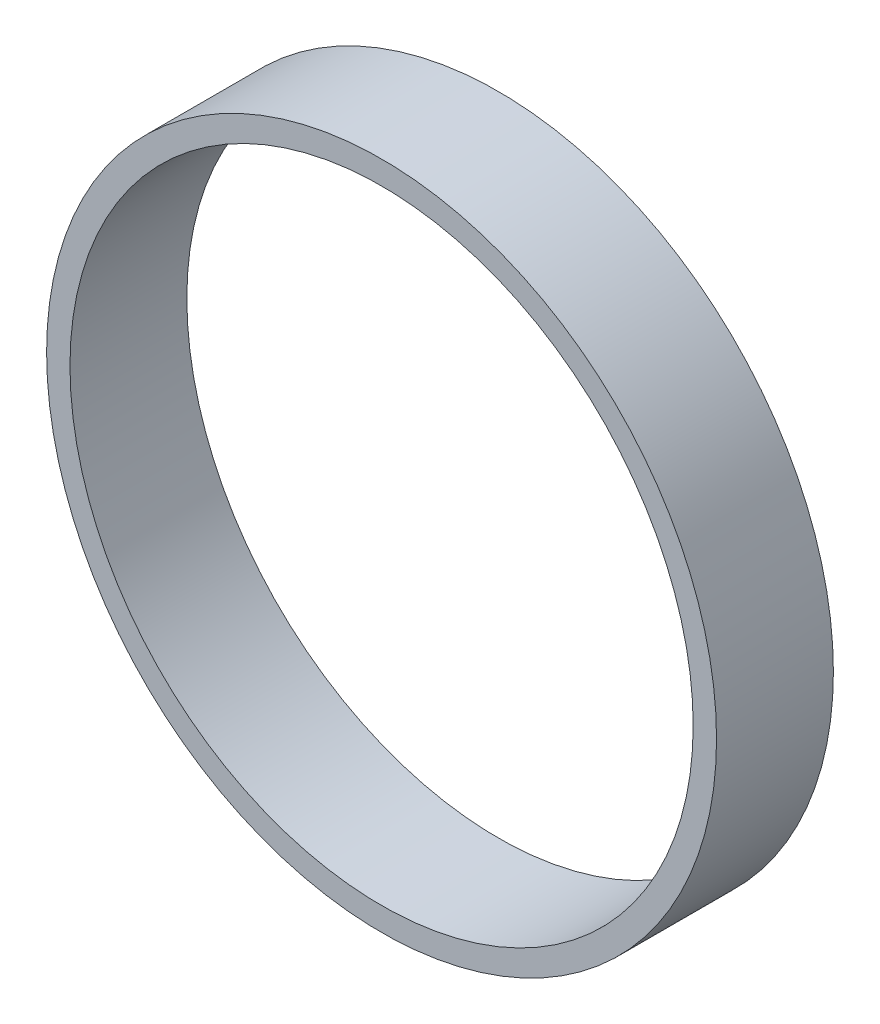
ISO-10303-21;
HEADER;
FILE_DESCRIPTION(('STEP AP214'),'2;1');
FILE_NAME('part.step','',(''),(''),'','','');
FILE_SCHEMA(('AUTOMOTIVE_DESIGN { 1 0 10303 214 1 1 1 1 }'));
ENDSEC;
DATA;
#1=APPLICATION_CONTEXT('core data for automotive mechanical design processes');
#2=APPLICATION_PROTOCOL_DEFINITION('international standard','automotive_design',2000,#1);
#3=PRODUCT_CONTEXT('',#1,'mechanical');
#4=PRODUCT('Part','Part','',(#3));
#5=PRODUCT_RELATED_PRODUCT_CATEGORY('part','',(#4));
#6=PRODUCT_DEFINITION_FORMATION('','',#4);
#7=PRODUCT_DEFINITION_CONTEXT('part definition',#1,'design');
#8=PRODUCT_DEFINITION('design','',#6,#7);
#9=PRODUCT_DEFINITION_SHAPE('','',#8);
#10=(LENGTH_UNIT() NAMED_UNIT(*) SI_UNIT(.MILLI.,.METRE.));
#11=(NAMED_UNIT(*) PLANE_ANGLE_UNIT() SI_UNIT($,.RADIAN.));
#12=(NAMED_UNIT(*) SI_UNIT($,.STERADIAN.) SOLID_ANGLE_UNIT());
#13=UNCERTAINTY_MEASURE_WITH_UNIT(LENGTH_MEASURE(1.E-05),#10,'distance_accuracy_value','');
#14=(GEOMETRIC_REPRESENTATION_CONTEXT(3) GLOBAL_UNCERTAINTY_ASSIGNED_CONTEXT((#13)) GLOBAL_UNIT_ASSIGNED_CONTEXT((#10,
#11,#12)) REPRESENTATION_CONTEXT('',''));
#15=CARTESIAN_POINT('',(0.,0.,0.));
#16=DIRECTION('',(0.,0.,1.));
#17=DIRECTION('',(1.,0.,0.));
#18=AXIS2_PLACEMENT_3D('',#15,#16,#17);
#19=CARTESIAN_POINT('',(0.,0.,19.05));
#20=DIRECTION('',(0.,0.,1.));
#21=DIRECTION('',(1.,0.,0.));
#22=AXIS2_PLACEMENT_3D('',#19,#20,#21);
#23=PLANE('',#22);
#24=CARTESIAN_POINT('',(0.,0.,19.05));
#25=DIRECTION('',(0.,0.,1.));
#26=DIRECTION('',(1.,0.,0.));
#27=AXIS2_PLACEMENT_3D('',#24,#25,#26);
#28=CIRCLE('',#27,54.61);
#29=CARTESIAN_POINT('',(-54.61,0.,19.05));
#30=VERTEX_POINT('',#29);
#31=EDGE_CURVE('E10',#30,#30,#28,.T.);
#32=ORIENTED_EDGE('',*,*,#31,.T.);
#33=EDGE_LOOP('',(#32));
#34=FACE_BOUND('',#33,.T.);
#35=CARTESIAN_POINT('',(0.,0.,19.05));
#36=DIRECTION('',(0.,0.,1.));
#37=DIRECTION('',(1.,0.,0.));
#38=AXIS2_PLACEMENT_3D('',#35,#36,#37);
#39=CIRCLE('',#38,50.8);
#40=CARTESIAN_POINT('',(-50.8,0.,19.05));
#41=VERTEX_POINT('',#40);
#42=EDGE_CURVE('E54',#41,#41,#39,.T.);
#43=ORIENTED_EDGE('',*,*,#42,.F.);
#44=EDGE_LOOP('',(#43));
#45=FACE_BOUND('',#44,.T.);
#46=ADVANCED_FACE('F41',(#34,#45),#23,.T.);
#47=CARTESIAN_POINT('',(0.,0.,0.));
#48=DIRECTION('',(0.,0.,1.));
#49=DIRECTION('',(1.,0.,0.));
#50=AXIS2_PLACEMENT_3D('',#47,#48,#49);
#51=PLANE('',#50);
#52=CARTESIAN_POINT('',(0.,0.,0.));
#53=DIRECTION('',(0.,0.,1.));
#54=DIRECTION('',(1.,0.,0.));
#55=AXIS2_PLACEMENT_3D('',#52,#53,#54);
#56=CIRCLE('',#55,54.61);
#57=CARTESIAN_POINT('',(-54.61,0.,0.));
#58=VERTEX_POINT('',#57);
#59=EDGE_CURVE('E45',#58,#58,#56,.T.);
#60=ORIENTED_EDGE('',*,*,#59,.F.);
#61=EDGE_LOOP('',(#60));
#62=FACE_BOUND('',#61,.T.);
#63=CARTESIAN_POINT('',(0.,0.,0.));
#64=DIRECTION('',(0.,0.,1.));
#65=DIRECTION('',(1.,0.,0.));
#66=AXIS2_PLACEMENT_3D('',#63,#64,#65);
#67=CIRCLE('',#66,50.8);
#68=CARTESIAN_POINT('',(-50.8,0.,0.));
#69=VERTEX_POINT('',#68);
#70=EDGE_CURVE('E56',#69,#69,#67,.T.);
#71=ORIENTED_EDGE('',*,*,#70,.T.);
#72=EDGE_LOOP('',(#71));
#73=FACE_BOUND('',#72,.T.);
#74=ADVANCED_FACE('F68',(#62,#73),#51,.F.);
#75=CARTESIAN_POINT('',(0.,0.,19.05));
#76=DIRECTION('',(0.,0.,-1.));
#77=DIRECTION('',(-1.,0.,0.));
#78=AXIS2_PLACEMENT_3D('',#75,#76,#77);
#79=CYLINDRICAL_SURFACE('',#78,54.61);
#80=CARTESIAN_POINT('',(-54.61,0.,19.05));
#81=CARTESIAN_POINT('',(-54.61,0.,18.8515625));
#82=CARTESIAN_POINT('',(-54.61,0.,18.653125));
#83=CARTESIAN_POINT('',(-54.61,0.,18.25625));
#84=CARTESIAN_POINT('',(-54.61,0.,18.0578125));
#85=CARTESIAN_POINT('',(-54.61,0.,17.6609375));
#86=CARTESIAN_POINT('',(-54.61,0.,17.4625));
#87=CARTESIAN_POINT('',(-54.61,0.,17.065625));
#88=CARTESIAN_POINT('',(-54.61,0.,16.8671875));
#89=CARTESIAN_POINT('',(-54.61,0.,16.4703125));
#90=CARTESIAN_POINT('',(-54.61,0.,16.271875));
#91=CARTESIAN_POINT('',(-54.61,0.,15.875));
#92=CARTESIAN_POINT('',(-54.61,0.,15.6765625));
#93=CARTESIAN_POINT('',(-54.61,0.,15.2796875));
#94=CARTESIAN_POINT('',(-54.61,0.,15.08125));
#95=CARTESIAN_POINT('',(-54.61,0.,14.684375));
#96=CARTESIAN_POINT('',(-54.61,0.,14.4859375));
#97=CARTESIAN_POINT('',(-54.61,0.,14.0890625));
#98=CARTESIAN_POINT('',(-54.61,0.,13.890625));
#99=CARTESIAN_POINT('',(-54.61,0.,13.49375));
#100=CARTESIAN_POINT('',(-54.61,0.,13.2953125));
#101=CARTESIAN_POINT('',(-54.61,0.,12.8984375));
#102=CARTESIAN_POINT('',(-54.61,0.,12.7));
#103=CARTESIAN_POINT('',(-54.61,0.,12.303125));
#104=CARTESIAN_POINT('',(-54.61,0.,12.1046875));
#105=CARTESIAN_POINT('',(-54.61,0.,11.7078125));
#106=CARTESIAN_POINT('',(-54.61,0.,11.509375));
#107=CARTESIAN_POINT('',(-54.61,0.,11.1125));
#108=CARTESIAN_POINT('',(-54.61,0.,10.9140625));
#109=CARTESIAN_POINT('',(-54.61,0.,10.5171875));
#110=CARTESIAN_POINT('',(-54.61,0.,10.31875));
#111=CARTESIAN_POINT('',(-54.61,0.,9.921875));
#112=CARTESIAN_POINT('',(-54.61,0.,9.7234375));
#113=CARTESIAN_POINT('',(-54.61,0.,9.3265625));
#114=CARTESIAN_POINT('',(-54.61,0.,9.128125));
#115=CARTESIAN_POINT('',(-54.61,0.,8.73125));
#116=CARTESIAN_POINT('',(-54.61,0.,8.5328125));
#117=CARTESIAN_POINT('',(-54.61,0.,8.1359375));
#118=CARTESIAN_POINT('',(-54.61,0.,7.9375));
#119=CARTESIAN_POINT('',(-54.61,0.,7.540625));
#120=CARTESIAN_POINT('',(-54.61,0.,7.3421875));
#121=CARTESIAN_POINT('',(-54.61,0.,6.9453125));
#122=CARTESIAN_POINT('',(-54.61,0.,6.746875));
#123=CARTESIAN_POINT('',(-54.61,0.,6.35));
#124=CARTESIAN_POINT('',(-54.61,0.,6.1515625));
#125=CARTESIAN_POINT('',(-54.61,0.,5.7546875));
#126=CARTESIAN_POINT('',(-54.61,0.,5.55625));
#127=CARTESIAN_POINT('',(-54.61,0.,5.159375));
#128=CARTESIAN_POINT('',(-54.61,0.,4.9609375));
#129=CARTESIAN_POINT('',(-54.61,0.,4.5640625));
#130=CARTESIAN_POINT('',(-54.61,0.,4.365625));
#131=CARTESIAN_POINT('',(-54.61,0.,3.96875));
#132=CARTESIAN_POINT('',(-54.61,0.,3.7703125));
#133=CARTESIAN_POINT('',(-54.61,0.,3.3734375));
#134=CARTESIAN_POINT('',(-54.61,0.,3.175));
#135=CARTESIAN_POINT('',(-54.61,0.,2.778125));
#136=CARTESIAN_POINT('',(-54.61,0.,2.5796875));
#137=CARTESIAN_POINT('',(-54.61,0.,2.1828125));
#138=CARTESIAN_POINT('',(-54.61,0.,1.984375));
#139=CARTESIAN_POINT('',(-54.61,0.,1.5875));
#140=CARTESIAN_POINT('',(-54.61,0.,1.3890625));
#141=CARTESIAN_POINT('',(-54.61,0.,0.992187500000001));
#142=CARTESIAN_POINT('',(-54.61,0.,0.793750000000001));
#143=CARTESIAN_POINT('',(-54.61,0.,0.396875));
#144=CARTESIAN_POINT('',(-54.61,0.,0.1984375));
#145=CARTESIAN_POINT('',(-54.61,0.,0.));
#146=B_SPLINE_CURVE_WITH_KNOTS('',3,(#80,#81,#82,#83,#84,#85,#86,#87,#88,#89,#90,#91,#92,#93,
#94,#95,#96,#97,#98,#99,#100,#101,#102,#103,#104,#105,#106,#107,#108,#109,#110,#111,#112,#113,
#114,#115,#116,#117,#118,#119,#120,#121,#122,#123,#124,#125,#126,#127,#128,#129,#130,#131,#132,
#133,#134,#135,#136,#137,#138,#139,#140,#141,#142,#143,#144,#145),.UNSPECIFIED.,.F.,.F.,(4,2,2,
2,2,2,2,2,2,2,2,2,2,2,2,2,2,2,2,2,2,2,2,2,2,2,2,2,2,2,2,2,4),(0.,0.5953125,1.190625,1.7859375,
2.38125,2.9765625,3.571875,4.1671875,4.7625,5.3578125,5.953125,6.5484375,7.14375,7.7390625,
8.334375,8.9296875,9.525,10.1203125,10.715625,11.3109375,11.90625,12.5015625,13.096875,
13.6921875,14.2875,14.8828125,15.478125,16.0734375,16.66875,17.2640625,17.859375,18.4546875,
19.05),.UNSPECIFIED.);
#147=EDGE_CURVE('BSEAM43',#30,#58,#146,.T.);
#148=ORIENTED_EDGE('',*,*,#31,.F.);
#149=ORIENTED_EDGE('',*,*,#59,.T.);
#150=ORIENTED_EDGE('',*,*,#147,.T.);
#151=ORIENTED_EDGE('',*,*,#147,.F.);
#152=EDGE_LOOP('',(#148,#150,#149,#151));
#153=FACE_BOUND('',#152,.T.);
#154=ADVANCED_FACE('F43',(#153),#79,.T.);
#155=CARTESIAN_POINT('',(0.,0.,19.05));
#156=DIRECTION('',(0.,0.,-1.));
#157=DIRECTION('',(-1.,0.,0.));
#158=AXIS2_PLACEMENT_3D('',#155,#156,#157);
#159=CYLINDRICAL_SURFACE('',#158,50.8);
#160=CARTESIAN_POINT('',(-50.8,0.,19.05));
#161=CARTESIAN_POINT('',(-50.8,0.,18.8515625));
#162=CARTESIAN_POINT('',(-50.8,0.,18.653125));
#163=CARTESIAN_POINT('',(-50.8,0.,18.25625));
#164=CARTESIAN_POINT('',(-50.8,0.,18.0578125));
#165=CARTESIAN_POINT('',(-50.8,0.,17.6609375));
#166=CARTESIAN_POINT('',(-50.8,0.,17.4625));
#167=CARTESIAN_POINT('',(-50.8,0.,17.065625));
#168=CARTESIAN_POINT('',(-50.8,0.,16.8671875));
#169=CARTESIAN_POINT('',(-50.8,0.,16.4703125));
#170=CARTESIAN_POINT('',(-50.8,0.,16.271875));
#171=CARTESIAN_POINT('',(-50.8,0.,15.875));
#172=CARTESIAN_POINT('',(-50.8,0.,15.6765625));
#173=CARTESIAN_POINT('',(-50.8,0.,15.2796875));
#174=CARTESIAN_POINT('',(-50.8,0.,15.08125));
#175=CARTESIAN_POINT('',(-50.8,0.,14.684375));
#176=CARTESIAN_POINT('',(-50.8,0.,14.4859375));
#177=CARTESIAN_POINT('',(-50.8,0.,14.0890625));
#178=CARTESIAN_POINT('',(-50.8,0.,13.890625));
#179=CARTESIAN_POINT('',(-50.8,0.,13.49375));
#180=CARTESIAN_POINT('',(-50.8,0.,13.2953125));
#181=CARTESIAN_POINT('',(-50.8,0.,12.8984375));
#182=CARTESIAN_POINT('',(-50.8,0.,12.7));
#183=CARTESIAN_POINT('',(-50.8,0.,12.303125));
#184=CARTESIAN_POINT('',(-50.8,0.,12.1046875));
#185=CARTESIAN_POINT('',(-50.8,0.,11.7078125));
#186=CARTESIAN_POINT('',(-50.8,0.,11.509375));
#187=CARTESIAN_POINT('',(-50.8,0.,11.1125));
#188=CARTESIAN_POINT('',(-50.8,0.,10.9140625));
#189=CARTESIAN_POINT('',(-50.8,0.,10.5171875));
#190=CARTESIAN_POINT('',(-50.8,0.,10.31875));
#191=CARTESIAN_POINT('',(-50.8,0.,9.921875));
#192=CARTESIAN_POINT('',(-50.8,0.,9.7234375));
#193=CARTESIAN_POINT('',(-50.8,0.,9.3265625));
#194=CARTESIAN_POINT('',(-50.8,0.,9.128125));
#195=CARTESIAN_POINT('',(-50.8,0.,8.73125));
#196=CARTESIAN_POINT('',(-50.8,0.,8.5328125));
#197=CARTESIAN_POINT('',(-50.8,0.,8.1359375));
#198=CARTESIAN_POINT('',(-50.8,0.,7.9375));
#199=CARTESIAN_POINT('',(-50.8,0.,7.540625));
#200=CARTESIAN_POINT('',(-50.8,0.,7.3421875));
#201=CARTESIAN_POINT('',(-50.8,0.,6.9453125));
#202=CARTESIAN_POINT('',(-50.8,0.,6.746875));
#203=CARTESIAN_POINT('',(-50.8,0.,6.35));
#204=CARTESIAN_POINT('',(-50.8,0.,6.1515625));
#205=CARTESIAN_POINT('',(-50.8,0.,5.7546875));
#206=CARTESIAN_POINT('',(-50.8,0.,5.55625));
#207=CARTESIAN_POINT('',(-50.8,0.,5.159375));
#208=CARTESIAN_POINT('',(-50.8,0.,4.9609375));
#209=CARTESIAN_POINT('',(-50.8,0.,4.5640625));
#210=CARTESIAN_POINT('',(-50.8,0.,4.365625));
#211=CARTESIAN_POINT('',(-50.8,0.,3.96875));
#212=CARTESIAN_POINT('',(-50.8,0.,3.7703125));
#213=CARTESIAN_POINT('',(-50.8,0.,3.3734375));
#214=CARTESIAN_POINT('',(-50.8,0.,3.175));
#215=CARTESIAN_POINT('',(-50.8,0.,2.778125));
#216=CARTESIAN_POINT('',(-50.8,0.,2.5796875));
#217=CARTESIAN_POINT('',(-50.8,0.,2.1828125));
#218=CARTESIAN_POINT('',(-50.8,0.,1.984375));
#219=CARTESIAN_POINT('',(-50.8,0.,1.5875));
#220=CARTESIAN_POINT('',(-50.8,0.,1.3890625));
#221=CARTESIAN_POINT('',(-50.8,0.,0.992187500000001));
#222=CARTESIAN_POINT('',(-50.8,0.,0.793750000000001));
#223=CARTESIAN_POINT('',(-50.8,0.,0.396875));
#224=CARTESIAN_POINT('',(-50.8,0.,0.1984375));
#225=CARTESIAN_POINT('',(-50.8,0.,0.));
#226=B_SPLINE_CURVE_WITH_KNOTS('',3,(#160,#161,#162,#163,#164,#165,#166,#167,#168,#169,#170,
#171,#172,#173,#174,#175,#176,#177,#178,#179,#180,#181,#182,#183,#184,#185,#186,#187,#188,#189,
#190,#191,#192,#193,#194,#195,#196,#197,#198,#199,#200,#201,#202,#203,#204,#205,#206,#207,#208,
#209,#210,#211,#212,#213,#214,#215,#216,#217,#218,#219,#220,#221,#222,#223,#224,#225),
.UNSPECIFIED.,.F.,.F.,(4,2,2,2,2,2,2,2,2,2,2,2,2,2,2,2,2,2,2,2,2,2,2,2,2,2,2,2,2,2,2,2,4),(0.,
0.595312499999997,1.190625,1.7859375,2.38125,2.9765625,3.571875,4.1671875,4.7625,5.3578125,
5.953125,6.5484375,7.14375,7.7390625,8.334375,8.9296875,9.525,10.1203125,10.715625,11.3109375,
11.90625,12.5015625,13.096875,13.6921875,14.2875,14.8828125,15.478125,16.0734375,16.66875,
17.2640625,17.859375,18.4546875,19.05),.UNSPECIFIED.);
#227=EDGE_CURVE('BSEAM64',#41,#69,#226,.T.);
#228=ORIENTED_EDGE('',*,*,#42,.T.);
#229=ORIENTED_EDGE('',*,*,#70,.F.);
#230=ORIENTED_EDGE('',*,*,#227,.T.);
#231=ORIENTED_EDGE('',*,*,#227,.F.);
#232=EDGE_LOOP('',(#228,#230,#229,#231));
#233=FACE_BOUND('',#232,.T.);
#234=ADVANCED_FACE('F64',(#233),#159,.F.);
#235=CLOSED_SHELL('',(#46,#74,#154,#234));
#236=MANIFOLD_SOLID_BREP('B2',#235);
#237=ADVANCED_BREP_SHAPE_REPRESENTATION('',(#18,#236),#14);
#238=SHAPE_DEFINITION_REPRESENTATION(#9,#237);
ENDSEC;
END-ISO-10303-21;
